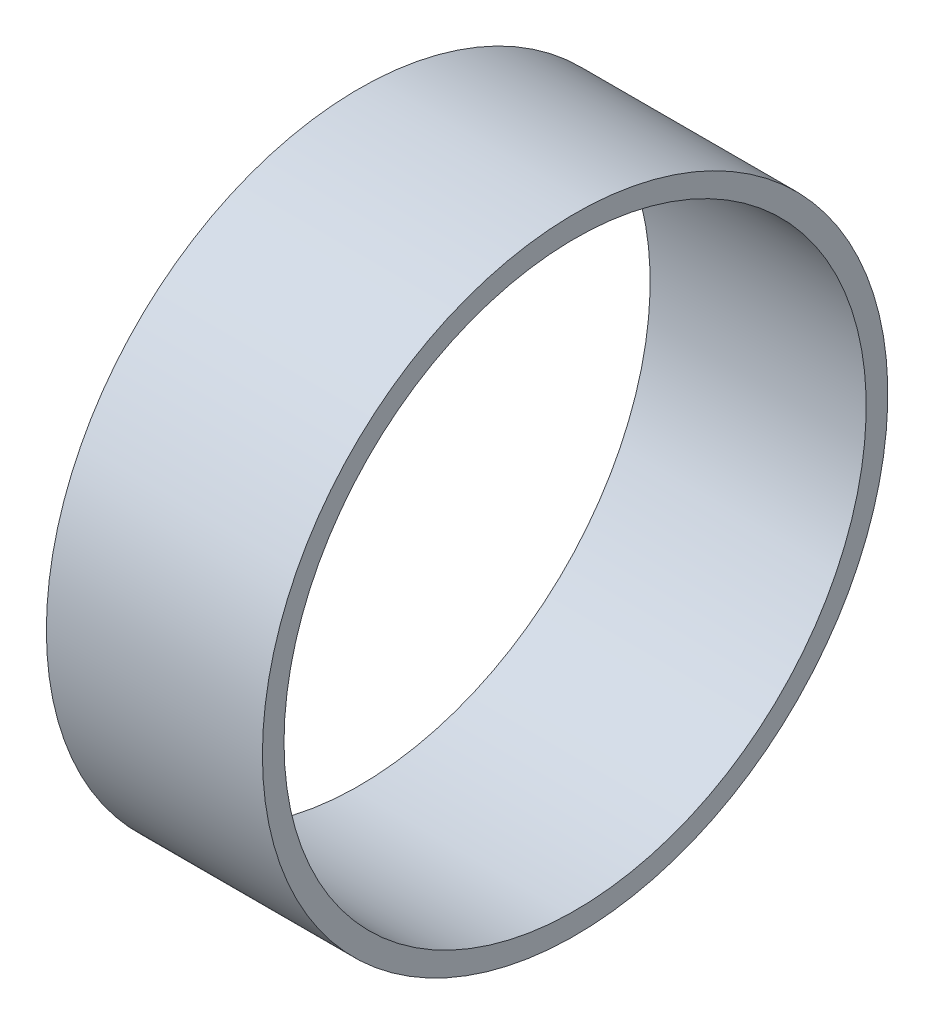
ISO-10303-21;
HEADER;
FILE_DESCRIPTION(('STEP AP214'),'2;1');
FILE_NAME('part.step','',(''),(''),'','','');
FILE_SCHEMA(('AUTOMOTIVE_DESIGN { 1 0 10303 214 1 1 1 1 }'));
ENDSEC;
DATA;
#1=APPLICATION_CONTEXT('core data for automotive mechanical design processes');
#2=APPLICATION_PROTOCOL_DEFINITION('international standard','automotive_design',2000,#1);
#3=PRODUCT_CONTEXT('',#1,'mechanical');
#4=PRODUCT('Part','Part','',(#3));
#5=PRODUCT_RELATED_PRODUCT_CATEGORY('part','',(#4));
#6=PRODUCT_DEFINITION_FORMATION('','',#4);
#7=PRODUCT_DEFINITION_CONTEXT('part definition',#1,'design');
#8=PRODUCT_DEFINITION('design','',#6,#7);
#9=PRODUCT_DEFINITION_SHAPE('','',#8);
#10=(LENGTH_UNIT() NAMED_UNIT(*) SI_UNIT(.MILLI.,.METRE.));
#11=(NAMED_UNIT(*) PLANE_ANGLE_UNIT() SI_UNIT($,.RADIAN.));
#12=(NAMED_UNIT(*) SI_UNIT($,.STERADIAN.) SOLID_ANGLE_UNIT());
#13=UNCERTAINTY_MEASURE_WITH_UNIT(LENGTH_MEASURE(1.E-05),#10,'distance_accuracy_value','');
#14=(GEOMETRIC_REPRESENTATION_CONTEXT(3) GLOBAL_UNCERTAINTY_ASSIGNED_CONTEXT((#13)) GLOBAL_UNIT_ASSIGNED_CONTEXT((#10,
#11,#12)) REPRESENTATION_CONTEXT('',''));
#15=CARTESIAN_POINT('',(0.,0.,0.));
#16=DIRECTION('',(0.,0.,1.));
#17=DIRECTION('',(1.,0.,0.));
#18=AXIS2_PLACEMENT_3D('',#15,#16,#17);
#19=CARTESIAN_POINT('',(-1.5,0.,0.));
#20=DIRECTION('',(-1.,0.,0.));
#21=DIRECTION('',(0.,0.,-1.));
#22=AXIS2_PLACEMENT_3D('',#19,#20,#21);
#23=CYLINDRICAL_SURFACE('',#22,12.8);
#24=CARTESIAN_POINT('',(-1.5,0.,0.));
#25=DIRECTION('',(-1.,0.,0.));
#26=DIRECTION('',(0.,0.,-1.));
#27=AXIS2_PLACEMENT_3D('',#24,#25,#26);
#28=CIRCLE('',#27,12.8);
#29=CARTESIAN_POINT('',(-1.5,0.,12.8));
#30=VERTEX_POINT('',#29);
#31=EDGE_CURVE('E20',#30,#30,#28,.T.);
#32=ORIENTED_EDGE('',*,*,#31,.F.);
#33=DIRECTION('',(-1.,0.,0.));
#34=VECTOR('',#33,1.);
#35=CARTESIAN_POINT('',(-1.5,0.,12.8));
#36=LINE('',#35,#34);
#37=CARTESIAN_POINT('',(-11.,0.,12.8));
#38=VERTEX_POINT('',#37);
#39=EDGE_CURVE('E11',#30,#38,#36,.T.);
#40=ORIENTED_EDGE('',*,*,#39,.T.);
#41=CARTESIAN_POINT('',(-11.,0.,0.));
#42=DIRECTION('',(1.,0.,0.));
#43=DIRECTION('',(0.,0.,-1.));
#44=AXIS2_PLACEMENT_3D('',#41,#42,#43);
#45=CIRCLE('',#44,12.8);
#46=EDGE_CURVE('E56',#38,#38,#45,.T.);
#47=ORIENTED_EDGE('',*,*,#46,.F.);
#48=ORIENTED_EDGE('',*,*,#39,.F.);
#49=EDGE_LOOP('',(#32,#40,#47,#48));
#50=FACE_BOUND('',#49,.T.);
#51=ADVANCED_FACE('F16',(#50),#23,.F.);
#52=CARTESIAN_POINT('',(-1.5,0.,0.));
#53=DIRECTION('',(1.,0.,0.));
#54=DIRECTION('',(0.,1.,0.));
#55=AXIS2_PLACEMENT_3D('',#52,#53,#54);
#56=PLANE('',#55);
#57=ORIENTED_EDGE('',*,*,#31,.T.);
#58=EDGE_LOOP('',(#57));
#59=FACE_BOUND('',#58,.T.);
#60=CARTESIAN_POINT('',(-1.5,0.,0.));
#61=DIRECTION('',(1.,0.,0.));
#62=DIRECTION('',(0.,0.,-1.));
#63=AXIS2_PLACEMENT_3D('',#60,#61,#62);
#64=CIRCLE('',#63,13.75);
#65=CARTESIAN_POINT('',(-1.5,0.,13.75));
#66=VERTEX_POINT('',#65);
#67=EDGE_CURVE('E54',#66,#66,#64,.T.);
#68=ORIENTED_EDGE('',*,*,#67,.T.);
#69=EDGE_LOOP('',(#68));
#70=FACE_BOUND('',#69,.T.);
#71=ADVANCED_FACE('F104',(#59,#70),#56,.T.);
#72=CARTESIAN_POINT('',(-1.5,0.,0.));
#73=DIRECTION('',(-1.,0.,0.));
#74=DIRECTION('',(0.,0.,-1.));
#75=AXIS2_PLACEMENT_3D('',#72,#73,#74);
#76=CYLINDRICAL_SURFACE('',#75,13.75);
#77=CARTESIAN_POINT('',(-11.,0.,0.));
#78=DIRECTION('',(1.,0.,0.));
#79=DIRECTION('',(0.,0.,-1.));
#80=AXIS2_PLACEMENT_3D('',#77,#78,#79);
#81=CIRCLE('',#80,13.75);
#82=CARTESIAN_POINT('',(-11.,0.,13.75));
#83=VERTEX_POINT('',#82);
#84=EDGE_CURVE('E53',#83,#83,#81,.T.);
#85=ORIENTED_EDGE('',*,*,#84,.T.);
#86=DIRECTION('',(1.,0.,0.));
#87=VECTOR('',#86,1.);
#88=CARTESIAN_POINT('',(-1.5,0.,13.75));
#89=LINE('',#88,#87);
#90=EDGE_CURVE('E50',#83,#66,#89,.T.);
#91=ORIENTED_EDGE('',*,*,#90,.T.);
#92=ORIENTED_EDGE('',*,*,#67,.F.);
#93=ORIENTED_EDGE('',*,*,#90,.F.);
#94=EDGE_LOOP('',(#85,#91,#92,#93));
#95=FACE_BOUND('',#94,.T.);
#96=ADVANCED_FACE('F51',(#95),#76,.T.);
#97=CARTESIAN_POINT('',(-11.,0.,0.));
#98=DIRECTION('',(1.,0.,0.));
#99=DIRECTION('',(0.,1.,0.));
#100=AXIS2_PLACEMENT_3D('',#97,#98,#99);
#101=PLANE('',#100);
#102=ORIENTED_EDGE('',*,*,#46,.T.);
#103=EDGE_LOOP('',(#102));
#104=FACE_BOUND('',#103,.T.);
#105=ORIENTED_EDGE('',*,*,#84,.F.);
#106=EDGE_LOOP('',(#105));
#107=FACE_BOUND('',#106,.T.);
#108=ADVANCED_FACE('F18',(#104,#107),#101,.F.);
#109=CLOSED_SHELL('',(#51,#71,#96,#108));
#110=MANIFOLD_SOLID_BREP('B1',#109);
#111=ADVANCED_BREP_SHAPE_REPRESENTATION('',(#18,#110),#14);
#112=SHAPE_DEFINITION_REPRESENTATION(#9,#111);
ENDSEC;
END-ISO-10303-21;
